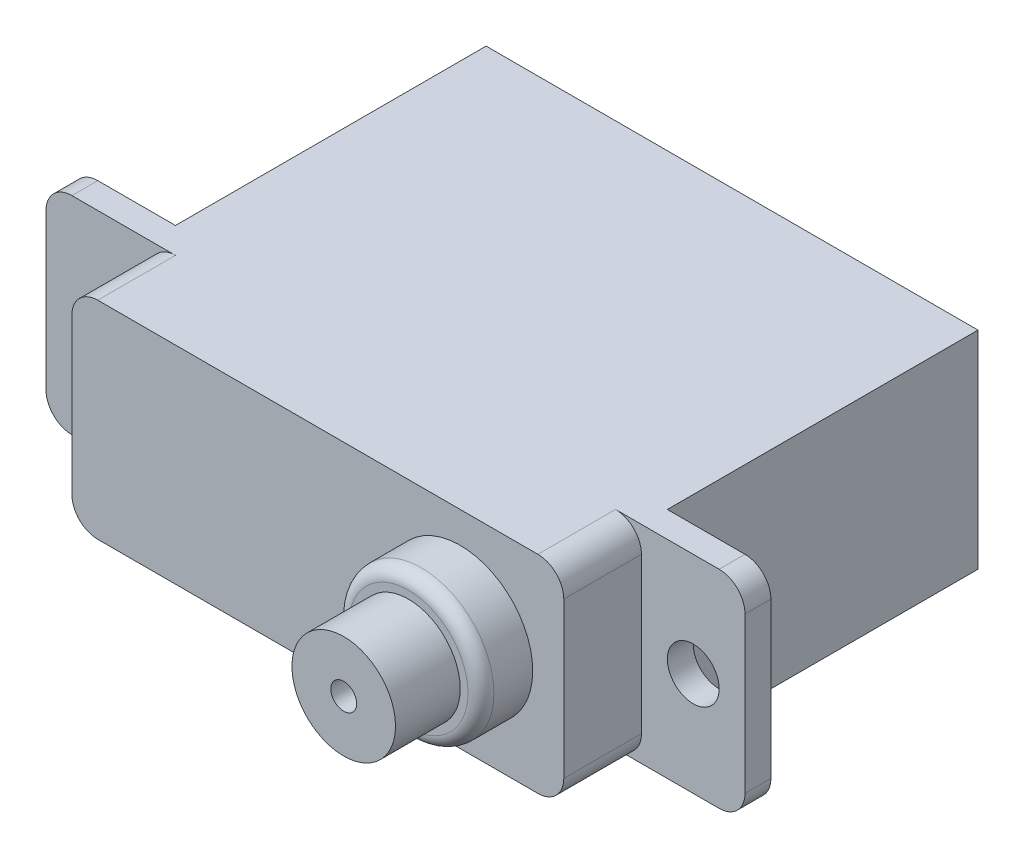
ISO-10303-21;
HEADER;
FILE_DESCRIPTION(('STEP AP214'),'2;1');
FILE_NAME('part.step','',(''),(''),'','','');
FILE_SCHEMA(('AUTOMOTIVE_DESIGN { 1 0 10303 214 1 1 1 1 }'));
ENDSEC;
DATA;
#1=APPLICATION_CONTEXT('core data for automotive mechanical design processes');
#2=APPLICATION_PROTOCOL_DEFINITION('international standard','automotive_design',2000,#1);
#3=PRODUCT_CONTEXT('',#1,'mechanical');
#4=PRODUCT('Part','Part','',(#3));
#5=PRODUCT_RELATED_PRODUCT_CATEGORY('part','',(#4));
#6=PRODUCT_DEFINITION_FORMATION('','',#4);
#7=PRODUCT_DEFINITION_CONTEXT('part definition',#1,'design');
#8=PRODUCT_DEFINITION('design','',#6,#7);
#9=PRODUCT_DEFINITION_SHAPE('','',#8);
#10=(LENGTH_UNIT() NAMED_UNIT(*) SI_UNIT(.MILLI.,.METRE.));
#11=(NAMED_UNIT(*) PLANE_ANGLE_UNIT() SI_UNIT($,.RADIAN.));
#12=(NAMED_UNIT(*) SI_UNIT($,.STERADIAN.) SOLID_ANGLE_UNIT());
#13=UNCERTAINTY_MEASURE_WITH_UNIT(LENGTH_MEASURE(1.E-05),#10,'distance_accuracy_value','');
#14=(GEOMETRIC_REPRESENTATION_CONTEXT(3) GLOBAL_UNCERTAINTY_ASSIGNED_CONTEXT((#13)) GLOBAL_UNIT_ASSIGNED_CONTEXT((#10,
#11,#12)) REPRESENTATION_CONTEXT('',''));
#15=CARTESIAN_POINT('',(0.,0.,0.));
#16=DIRECTION('',(0.,0.,1.));
#17=DIRECTION('',(1.,0.,0.));
#18=AXIS2_PLACEMENT_3D('',#15,#16,#17);
#19=CARTESIAN_POINT('',(5.5,0.,18.));
#20=DIRECTION('',(0.,0.,1.));
#21=DIRECTION('',(1.,0.,0.));
#22=AXIS2_PLACEMENT_3D('',#19,#20,#21);
#23=PLANE('',#22);
#24=CARTESIAN_POINT('',(5.5,0.,18.));
#25=DIRECTION('',(0.,0.,1.));
#26=DIRECTION('',(1.,0.,0.));
#27=AXIS2_PLACEMENT_3D('',#24,#25,#26);
#28=CIRCLE('',#27,2.3);
#29=CARTESIAN_POINT('',(7.8,0.,18.));
#30=VERTEX_POINT('',#29);
#31=EDGE_CURVE('E39',#30,#30,#28,.T.);
#32=ORIENTED_EDGE('',*,*,#31,.T.);
#33=EDGE_LOOP('',(#32));
#34=FACE_BOUND('',#33,.T.);
#35=CARTESIAN_POINT('',(5.5,0.,18.));
#36=DIRECTION('',(0.,0.,1.));
#37=DIRECTION('',(1.,0.,0.));
#38=AXIS2_PLACEMENT_3D('',#35,#36,#37);
#39=CIRCLE('',#38,2.);
#40=CARTESIAN_POINT('',(7.5,0.,18.));
#41=VERTEX_POINT('',#40);
#42=EDGE_CURVE('E518',#41,#41,#39,.T.);
#43=ORIENTED_EDGE('',*,*,#42,.F.);
#44=EDGE_LOOP('',(#43));
#45=FACE_BOUND('',#44,.T.);
#46=ADVANCED_FACE('F31',(#34,#45),#23,.T.);
#47=CARTESIAN_POINT('',(8.5,-3.,16.));
#48=DIRECTION('',(0.,0.,1.));
#49=DIRECTION('',(1.,0.,0.));
#50=AXIS2_PLACEMENT_3D('',#47,#48,#49);
#51=PLANE('',#50);
#52=CARTESIAN_POINT('',(8.5,-3.,16.));
#53=DIRECTION('',(0.,0.,1.));
#54=DIRECTION('',(1.,0.,0.));
#55=AXIS2_PLACEMENT_3D('',#52,#53,#54);
#56=CIRCLE('',#55,1.);
#57=CARTESIAN_POINT('',(8.49999999999999,-4.,16.));
#58=VERTEX_POINT('',#57);
#59=CARTESIAN_POINT('',(9.5,-2.99999999999999,16.));
#60=VERTEX_POINT('',#59);
#61=EDGE_CURVE('E178',#58,#60,#56,.T.);
#62=ORIENTED_EDGE('',*,*,#61,.T.);
#63=DIRECTION('',(0.,1.,0.));
#64=VECTOR('',#63,1.);
#65=CARTESIAN_POINT('',(9.5,-2.99999999999999,16.));
#66=LINE('',#65,#64);
#67=CARTESIAN_POINT('',(9.5,2.99999999999999,16.));
#68=VERTEX_POINT('',#67);
#69=EDGE_CURVE('E166',#60,#68,#66,.T.);
#70=ORIENTED_EDGE('',*,*,#69,.T.);
#71=CARTESIAN_POINT('',(8.5,3.,16.));
#72=DIRECTION('',(0.,0.,1.));
#73=DIRECTION('',(-1.,0.,0.));
#74=AXIS2_PLACEMENT_3D('',#71,#72,#73);
#75=CIRCLE('',#74,1.);
#76=CARTESIAN_POINT('',(8.49999999999999,4.,16.));
#77=VERTEX_POINT('',#76);
#78=EDGE_CURVE('E177',#68,#77,#75,.T.);
#79=ORIENTED_EDGE('',*,*,#78,.T.);
#80=DIRECTION('',(-1.,0.,0.));
#81=VECTOR('',#80,1.);
#82=CARTESIAN_POINT('',(-8.49999999999999,4.,16.));
#83=LINE('',#82,#81);
#84=CARTESIAN_POINT('',(-8.49999999999999,4.,16.));
#85=VERTEX_POINT('',#84);
#86=EDGE_CURVE('E511',#77,#85,#83,.T.);
#87=ORIENTED_EDGE('',*,*,#86,.T.);
#88=CARTESIAN_POINT('',(-8.5,3.,16.));
#89=DIRECTION('',(0.,0.,1.));
#90=DIRECTION('',(-1.,0.,0.));
#91=AXIS2_PLACEMENT_3D('',#88,#89,#90);
#92=CIRCLE('',#91,1.);
#93=CARTESIAN_POINT('',(-9.5,2.99999999999999,16.));
#94=VERTEX_POINT('',#93);
#95=EDGE_CURVE('E509',#85,#94,#92,.T.);
#96=ORIENTED_EDGE('',*,*,#95,.T.);
#97=DIRECTION('',(0.,-1.,0.));
#98=VECTOR('',#97,1.);
#99=CARTESIAN_POINT('',(-9.5,-2.99999999999999,16.));
#100=LINE('',#99,#98);
#101=CARTESIAN_POINT('',(-9.5,-2.99999999999999,16.));
#102=VERTEX_POINT('',#101);
#103=EDGE_CURVE('E507',#94,#102,#100,.T.);
#104=ORIENTED_EDGE('',*,*,#103,.T.);
#105=CARTESIAN_POINT('',(-8.5,-3.,16.));
#106=DIRECTION('',(0.,0.,1.));
#107=DIRECTION('',(-1.,0.,0.));
#108=AXIS2_PLACEMENT_3D('',#105,#106,#107);
#109=CIRCLE('',#108,1.);
#110=CARTESIAN_POINT('',(-8.49999999999999,-4.,16.));
#111=VERTEX_POINT('',#110);
#112=EDGE_CURVE('E467',#102,#111,#109,.T.);
#113=ORIENTED_EDGE('',*,*,#112,.T.);
#114=DIRECTION('',(1.,0.,0.));
#115=VECTOR('',#114,1.);
#116=CARTESIAN_POINT('',(-8.49999999999999,-4.,16.));
#117=LINE('',#116,#115);
#118=EDGE_CURVE('E184',#111,#58,#117,.T.);
#119=ORIENTED_EDGE('',*,*,#118,.T.);
#120=EDGE_LOOP('',(#62,#70,#79,#87,#96,#104,#113,#119));
#121=FACE_BOUND('',#120,.T.);
#122=CARTESIAN_POINT('',(5.5,0.,16.));
#123=DIRECTION('',(0.,0.,1.));
#124=DIRECTION('',(1.,0.,0.));
#125=AXIS2_PLACEMENT_3D('',#122,#123,#124);
#126=CIRCLE('',#125,2.8);
#127=CARTESIAN_POINT('',(8.3,0.,16.));
#128=VERTEX_POINT('',#127);
#129=EDGE_CURVE('E514',#128,#128,#126,.T.);
#130=ORIENTED_EDGE('',*,*,#129,.F.);
#131=EDGE_LOOP('',(#130));
#132=FACE_BOUND('',#131,.T.);
#133=ADVANCED_FACE('F181',(#121,#132),#51,.T.);
#134=CARTESIAN_POINT('',(12.5,3.,13.));
#135=DIRECTION('',(0.,0.,-1.));
#136=DIRECTION('',(-1.,0.,0.));
#137=AXIS2_PLACEMENT_3D('',#134,#135,#136);
#138=PLANE('',#137);
#139=CARTESIAN_POINT('',(-11.5,0.,13.));
#140=DIRECTION('',(0.,0.,1.));
#141=DIRECTION('',(1.,0.,0.));
#142=AXIS2_PLACEMENT_3D('',#139,#140,#141);
#143=CIRCLE('',#142,1.);
#144=CARTESIAN_POINT('',(-10.5,0.,13.));
#145=VERTEX_POINT('',#144);
#146=EDGE_CURVE('E203',#145,#145,#143,.T.);
#147=ORIENTED_EDGE('',*,*,#146,.F.);
#148=EDGE_LOOP('',(#147));
#149=FACE_BOUND('',#148,.T.);
#150=CARTESIAN_POINT('',(-8.5,-3.,13.));
#151=DIRECTION('',(0.,0.,1.));
#152=DIRECTION('',(-1.,0.,0.));
#153=AXIS2_PLACEMENT_3D('',#150,#151,#152);
#154=CIRCLE('',#153,1.);
#155=CARTESIAN_POINT('',(-9.5,-2.99999999999999,13.));
#156=VERTEX_POINT('',#155);
#157=CARTESIAN_POINT('',(-8.5,-4.,13.));
#158=VERTEX_POINT('',#157);
#159=EDGE_CURVE('E46',#156,#158,#154,.T.);
#160=ORIENTED_EDGE('',*,*,#159,.F.);
#161=DIRECTION('',(0.,-1.,0.));
#162=VECTOR('',#161,1.);
#163=CARTESIAN_POINT('',(-9.5,-2.99999999999999,13.));
#164=LINE('',#163,#162);
#165=CARTESIAN_POINT('',(-9.5,2.99999999999999,13.));
#166=VERTEX_POINT('',#165);
#167=EDGE_CURVE('E50',#166,#156,#164,.T.);
#168=ORIENTED_EDGE('',*,*,#167,.F.);
#169=CARTESIAN_POINT('',(-8.5,3.,13.));
#170=DIRECTION('',(0.,0.,1.));
#171=DIRECTION('',(-1.,0.,0.));
#172=AXIS2_PLACEMENT_3D('',#169,#170,#171);
#173=CIRCLE('',#172,1.);
#174=CARTESIAN_POINT('',(-8.5,4.,13.));
#175=VERTEX_POINT('',#174);
#176=EDGE_CURVE('E500',#175,#166,#173,.T.);
#177=ORIENTED_EDGE('',*,*,#176,.F.);
#178=DIRECTION('',(-1.,0.,0.));
#179=VECTOR('',#178,1.);
#180=CARTESIAN_POINT('',(-12.5,4.,13.));
#181=LINE('',#180,#179);
#182=CARTESIAN_POINT('',(-12.5,4.,13.));
#183=VERTEX_POINT('',#182);
#184=EDGE_CURVE('E212',#175,#183,#181,.T.);
#185=ORIENTED_EDGE('',*,*,#184,.T.);
#186=CARTESIAN_POINT('',(-12.5,3.,13.));
#187=DIRECTION('',(0.,0.,1.));
#188=DIRECTION('',(-1.,0.,0.));
#189=AXIS2_PLACEMENT_3D('',#186,#187,#188);
#190=CIRCLE('',#189,1.);
#191=CARTESIAN_POINT('',(-13.5,2.99999999999999,13.));
#192=VERTEX_POINT('',#191);
#193=EDGE_CURVE('E216',#183,#192,#190,.T.);
#194=ORIENTED_EDGE('',*,*,#193,.T.);
#195=DIRECTION('',(0.,-1.,0.));
#196=VECTOR('',#195,1.);
#197=CARTESIAN_POINT('',(-13.5,-2.99999999999999,13.));
#198=LINE('',#197,#196);
#199=CARTESIAN_POINT('',(-13.5,-2.99999999999999,13.));
#200=VERTEX_POINT('',#199);
#201=EDGE_CURVE('E323',#192,#200,#198,.T.);
#202=ORIENTED_EDGE('',*,*,#201,.T.);
#203=CARTESIAN_POINT('',(-12.5,-3.,13.));
#204=DIRECTION('',(0.,0.,1.));
#205=DIRECTION('',(-1.,0.,0.));
#206=AXIS2_PLACEMENT_3D('',#203,#204,#205);
#207=CIRCLE('',#206,1.);
#208=CARTESIAN_POINT('',(-12.5,-4.,13.));
#209=VERTEX_POINT('',#208);
#210=EDGE_CURVE('E446',#200,#209,#207,.T.);
#211=ORIENTED_EDGE('',*,*,#210,.T.);
#212=DIRECTION('',(1.,0.,0.));
#213=VECTOR('',#212,1.);
#214=CARTESIAN_POINT('',(-12.5,-4.,13.));
#215=LINE('',#214,#213);
#216=EDGE_CURVE('E444',#209,#158,#215,.T.);
#217=ORIENTED_EDGE('',*,*,#216,.T.);
#218=EDGE_LOOP('',(#160,#168,#177,#185,#194,#202,#211,#217));
#219=FACE_BOUND('',#218,.T.);
#220=ADVANCED_FACE('F369',(#149,#219),#138,.F.);
#221=CARTESIAN_POINT('',(11.5,0.,13.));
#222=DIRECTION('',(0.,0.,1.));
#223=DIRECTION('',(1.,0.,0.));
#224=AXIS2_PLACEMENT_3D('',#221,#222,#223);
#225=CIRCLE('',#224,1.);
#226=CARTESIAN_POINT('',(12.5,0.,13.));
#227=VERTEX_POINT('',#226);
#228=EDGE_CURVE('E194',#227,#227,#225,.T.);
#229=ORIENTED_EDGE('',*,*,#228,.F.);
#230=EDGE_LOOP('',(#229));
#231=FACE_BOUND('',#230,.T.);
#232=CARTESIAN_POINT('',(8.5,-3.,13.));
#233=DIRECTION('',(0.,0.,1.));
#234=DIRECTION('',(1.,0.,0.));
#235=AXIS2_PLACEMENT_3D('',#232,#233,#234);
#236=CIRCLE('',#235,1.);
#237=CARTESIAN_POINT('',(8.5,-4.,13.));
#238=VERTEX_POINT('',#237);
#239=CARTESIAN_POINT('',(9.5,-2.99999999999999,13.));
#240=VERTEX_POINT('',#239);
#241=EDGE_CURVE('E190',#238,#240,#236,.T.);
#242=ORIENTED_EDGE('',*,*,#241,.F.);
#243=CARTESIAN_POINT('',(12.5,-4.,13.));
#244=VERTEX_POINT('',#243);
#245=EDGE_CURVE('E447',#238,#244,#215,.T.);
#246=ORIENTED_EDGE('',*,*,#245,.T.);
#247=CARTESIAN_POINT('',(12.5,-3.,13.));
#248=DIRECTION('',(0.,0.,1.));
#249=DIRECTION('',(1.,0.,0.));
#250=AXIS2_PLACEMENT_3D('',#247,#248,#249);
#251=CIRCLE('',#250,1.);
#252=CARTESIAN_POINT('',(13.5,-2.99999999999999,13.));
#253=VERTEX_POINT('',#252);
#254=EDGE_CURVE('E453',#244,#253,#251,.T.);
#255=ORIENTED_EDGE('',*,*,#254,.T.);
#256=DIRECTION('',(0.,1.,0.));
#257=VECTOR('',#256,1.);
#258=CARTESIAN_POINT('',(13.5,-2.99999999999999,13.));
#259=LINE('',#258,#257);
#260=CARTESIAN_POINT('',(13.5,2.99999999999999,13.));
#261=VERTEX_POINT('',#260);
#262=EDGE_CURVE('E304',#253,#261,#259,.T.);
#263=ORIENTED_EDGE('',*,*,#262,.T.);
#264=CARTESIAN_POINT('',(12.5,3.,13.));
#265=DIRECTION('',(0.,0.,1.));
#266=DIRECTION('',(-1.,0.,0.));
#267=AXIS2_PLACEMENT_3D('',#264,#265,#266);
#268=CIRCLE('',#267,1.);
#269=CARTESIAN_POINT('',(12.5,4.,13.));
#270=VERTEX_POINT('',#269);
#271=EDGE_CURVE('E209',#261,#270,#268,.T.);
#272=ORIENTED_EDGE('',*,*,#271,.T.);
#273=CARTESIAN_POINT('',(8.5,4.,13.));
#274=VERTEX_POINT('',#273);
#275=EDGE_CURVE('E222',#270,#274,#181,.T.);
#276=ORIENTED_EDGE('',*,*,#275,.T.);
#277=CARTESIAN_POINT('',(8.5,3.,13.));
#278=DIRECTION('',(0.,0.,1.));
#279=DIRECTION('',(-1.,0.,0.));
#280=AXIS2_PLACEMENT_3D('',#277,#278,#279);
#281=CIRCLE('',#280,1.);
#282=CARTESIAN_POINT('',(9.5,2.99999999999999,13.));
#283=VERTEX_POINT('',#282);
#284=EDGE_CURVE('E498',#283,#274,#281,.T.);
#285=ORIENTED_EDGE('',*,*,#284,.F.);
#286=DIRECTION('',(0.,1.,0.));
#287=VECTOR('',#286,1.);
#288=CARTESIAN_POINT('',(9.5,-2.99999999999999,13.));
#289=LINE('',#288,#287);
#290=EDGE_CURVE('E501',#240,#283,#289,.T.);
#291=ORIENTED_EDGE('',*,*,#290,.F.);
#292=EDGE_LOOP('',(#242,#246,#255,#263,#272,#276,#285,#291));
#293=FACE_BOUND('',#292,.T.);
#294=ADVANCED_FACE('F362',(#231,#293),#138,.F.);
#295=CARTESIAN_POINT('',(9.5,-4.,12.));
#296=DIRECTION('',(-1.,0.,0.));
#297=DIRECTION('',(0.,0.,1.));
#298=AXIS2_PLACEMENT_3D('',#295,#296,#297);
#299=PLANE('',#298);
#300=DIRECTION('',(0.,1.,0.));
#301=VECTOR('',#300,1.);
#302=CARTESIAN_POINT('',(9.5,-4.,0.));
#303=LINE('',#302,#301);
#304=CARTESIAN_POINT('',(9.5,-4.,0.));
#305=VERTEX_POINT('',#304);
#306=CARTESIAN_POINT('',(9.5,4.,0.));
#307=VERTEX_POINT('',#306);
#308=EDGE_CURVE('E252',#305,#307,#303,.T.);
#309=ORIENTED_EDGE('',*,*,#308,.T.);
#310=DIRECTION('',(0.,0.,-1.));
#311=VECTOR('',#310,1.);
#312=CARTESIAN_POINT('',(9.5,4.,12.));
#313=LINE('',#312,#311);
#314=CARTESIAN_POINT('',(9.5,4.,12.));
#315=VERTEX_POINT('',#314);
#316=EDGE_CURVE('E233',#315,#307,#313,.T.);
#317=ORIENTED_EDGE('',*,*,#316,.F.);
#318=DIRECTION('',(0.,1.,0.));
#319=VECTOR('',#318,1.);
#320=CARTESIAN_POINT('',(9.5,-4.,12.));
#321=LINE('',#320,#319);
#322=CARTESIAN_POINT('',(9.5,-4.,12.));
#323=VERTEX_POINT('',#322);
#324=EDGE_CURVE('E237',#323,#315,#321,.T.);
#325=ORIENTED_EDGE('',*,*,#324,.F.);
#326=DIRECTION('',(0.,0.,-1.));
#327=VECTOR('',#326,1.);
#328=CARTESIAN_POINT('',(9.5,-4.,12.));
#329=LINE('',#328,#327);
#330=EDGE_CURVE('E226',#323,#305,#329,.T.);
#331=ORIENTED_EDGE('',*,*,#330,.T.);
#332=EDGE_LOOP('',(#309,#317,#325,#331));
#333=FACE_BOUND('',#332,.T.);
#334=ADVANCED_FACE('F351',(#333),#299,.F.);
#335=CARTESIAN_POINT('',(-9.5,4.,12.));
#336=DIRECTION('',(0.,-1.,0.));
#337=DIRECTION('',(0.,0.,-1.));
#338=AXIS2_PLACEMENT_3D('',#335,#336,#337);
#339=PLANE('',#338);
#340=DIRECTION('',(-1.,0.,0.));
#341=VECTOR('',#340,1.);
#342=CARTESIAN_POINT('',(-9.5,4.,0.));
#343=LINE('',#342,#341);
#344=CARTESIAN_POINT('',(-9.5,4.,0.));
#345=VERTEX_POINT('',#344);
#346=EDGE_CURVE('E270',#307,#345,#343,.T.);
#347=ORIENTED_EDGE('',*,*,#346,.T.);
#348=DIRECTION('',(0.,0.,-1.));
#349=VECTOR('',#348,1.);
#350=CARTESIAN_POINT('',(-9.5,4.,12.));
#351=LINE('',#350,#349);
#352=CARTESIAN_POINT('',(-9.5,4.,12.));
#353=VERTEX_POINT('',#352);
#354=EDGE_CURVE('E236',#353,#345,#351,.T.);
#355=ORIENTED_EDGE('',*,*,#354,.F.);
#356=DIRECTION('',(-1.,0.,0.));
#357=VECTOR('',#356,1.);
#358=CARTESIAN_POINT('',(-12.5,4.,12.));
#359=LINE('',#358,#357);
#360=CARTESIAN_POINT('',(-12.5,4.,12.));
#361=VERTEX_POINT('',#360);
#362=EDGE_CURVE('E247',#353,#361,#359,.T.);
#363=ORIENTED_EDGE('',*,*,#362,.T.);
#364=DIRECTION('',(0.,0.,-1.));
#365=VECTOR('',#364,1.);
#366=CARTESIAN_POINT('',(-12.5,4.,13.));
#367=LINE('',#366,#365);
#368=EDGE_CURVE('E277',#183,#361,#367,.T.);
#369=ORIENTED_EDGE('',*,*,#368,.F.);
#370=ORIENTED_EDGE('',*,*,#184,.F.);
#371=DIRECTION('',(0.,0.,-1.));
#372=VECTOR('',#371,1.);
#373=CARTESIAN_POINT('',(-8.49999999999999,4.,16.));
#374=LINE('',#373,#372);
#375=EDGE_CURVE('E483',#85,#175,#374,.T.);
#376=ORIENTED_EDGE('',*,*,#375,.F.);
#377=ORIENTED_EDGE('',*,*,#86,.F.);
#378=DIRECTION('',(0.,0.,-1.));
#379=VECTOR('',#378,1.);
#380=CARTESIAN_POINT('',(8.49999999999999,4.,16.));
#381=LINE('',#380,#379);
#382=EDGE_CURVE('E196',#77,#274,#381,.T.);
#383=ORIENTED_EDGE('',*,*,#382,.T.);
#384=ORIENTED_EDGE('',*,*,#275,.F.);
#385=DIRECTION('',(0.,0.,-1.));
#386=VECTOR('',#385,1.);
#387=CARTESIAN_POINT('',(12.5,4.,13.));
#388=LINE('',#387,#386);
#389=CARTESIAN_POINT('',(12.5,4.,12.));
#390=VERTEX_POINT('',#389);
#391=EDGE_CURVE('E273',#270,#390,#388,.T.);
#392=ORIENTED_EDGE('',*,*,#391,.T.);
#393=EDGE_CURVE('E333',#390,#315,#359,.T.);
#394=ORIENTED_EDGE('',*,*,#393,.T.);
#395=ORIENTED_EDGE('',*,*,#316,.T.);
#396=EDGE_LOOP('',(#347,#355,#363,#369,#370,#376,#377,#383,#384,#392,#394,#395));
#397=FACE_BOUND('',#396,.T.);
#398=ADVANCED_FACE('F352',(#397),#339,.F.);
#399=CARTESIAN_POINT('',(-9.5,-4.,12.));
#400=DIRECTION('',(1.,0.,0.));
#401=DIRECTION('',(0.,0.,-1.));
#402=AXIS2_PLACEMENT_3D('',#399,#400,#401);
#403=PLANE('',#402);
#404=DIRECTION('',(0.,-1.,0.));
#405=VECTOR('',#404,1.);
#406=CARTESIAN_POINT('',(-9.5,-4.,0.));
#407=LINE('',#406,#405);
#408=CARTESIAN_POINT('',(-9.5,-4.,0.));
#409=VERTEX_POINT('',#408);
#410=EDGE_CURVE('E269',#345,#409,#407,.T.);
#411=ORIENTED_EDGE('',*,*,#410,.T.);
#412=DIRECTION('',(0.,0.,-1.));
#413=VECTOR('',#412,1.);
#414=CARTESIAN_POINT('',(-9.5,-4.,12.));
#415=LINE('',#414,#413);
#416=CARTESIAN_POINT('',(-9.5,-4.,12.));
#417=VERTEX_POINT('',#416);
#418=EDGE_CURVE('E229',#417,#409,#415,.T.);
#419=ORIENTED_EDGE('',*,*,#418,.F.);
#420=DIRECTION('',(0.,-1.,0.));
#421=VECTOR('',#420,1.);
#422=CARTESIAN_POINT('',(-9.5,-4.,12.));
#423=LINE('',#422,#421);
#424=EDGE_CURVE('E230',#353,#417,#423,.T.);
#425=ORIENTED_EDGE('',*,*,#424,.F.);
#426=ORIENTED_EDGE('',*,*,#354,.T.);
#427=EDGE_LOOP('',(#411,#419,#425,#426));
#428=FACE_BOUND('',#427,.T.);
#429=ADVANCED_FACE('F354',(#428),#403,.F.);
#430=CARTESIAN_POINT('',(-9.5,-4.,12.));
#431=DIRECTION('',(0.,1.,0.));
#432=DIRECTION('',(0.,0.,1.));
#433=AXIS2_PLACEMENT_3D('',#430,#431,#432);
#434=PLANE('',#433);
#435=DIRECTION('',(1.,0.,0.));
#436=VECTOR('',#435,1.);
#437=CARTESIAN_POINT('',(-9.5,-4.,0.));
#438=LINE('',#437,#436);
#439=EDGE_CURVE('E241',#409,#305,#438,.T.);
#440=ORIENTED_EDGE('',*,*,#439,.T.);
#441=ORIENTED_EDGE('',*,*,#330,.F.);
#442=DIRECTION('',(1.,0.,0.));
#443=VECTOR('',#442,1.);
#444=CARTESIAN_POINT('',(-12.5,-4.,12.));
#445=LINE('',#444,#443);
#446=CARTESIAN_POINT('',(12.5,-4.,12.));
#447=VERTEX_POINT('',#446);
#448=EDGE_CURVE('E291',#323,#447,#445,.T.);
#449=ORIENTED_EDGE('',*,*,#448,.T.);
#450=DIRECTION('',(0.,0.,-1.));
#451=VECTOR('',#450,1.);
#452=CARTESIAN_POINT('',(12.5,-4.,13.));
#453=LINE('',#452,#451);
#454=EDGE_CURVE('E307',#244,#447,#453,.T.);
#455=ORIENTED_EDGE('',*,*,#454,.F.);
#456=ORIENTED_EDGE('',*,*,#245,.F.);
#457=DIRECTION('',(0.,0.,-1.));
#458=VECTOR('',#457,1.);
#459=CARTESIAN_POINT('',(8.49999999999999,-4.,16.));
#460=LINE('',#459,#458);
#461=EDGE_CURVE('E462',#58,#238,#460,.T.);
#462=ORIENTED_EDGE('',*,*,#461,.F.);
#463=ORIENTED_EDGE('',*,*,#118,.F.);
#464=DIRECTION('',(0.,0.,-1.));
#465=VECTOR('',#464,1.);
#466=CARTESIAN_POINT('',(-8.49999999999999,-4.,16.));
#467=LINE('',#466,#465);
#468=EDGE_CURVE('E463',#111,#158,#467,.T.);
#469=ORIENTED_EDGE('',*,*,#468,.T.);
#470=ORIENTED_EDGE('',*,*,#216,.F.);
#471=DIRECTION('',(0.,0.,-1.));
#472=VECTOR('',#471,1.);
#473=CARTESIAN_POINT('',(-12.5,-4.,13.));
#474=LINE('',#473,#472);
#475=CARTESIAN_POINT('',(-12.5,-4.,12.));
#476=VERTEX_POINT('',#475);
#477=EDGE_CURVE('E310',#209,#476,#474,.T.);
#478=ORIENTED_EDGE('',*,*,#477,.T.);
#479=EDGE_CURVE('E287',#476,#417,#445,.T.);
#480=ORIENTED_EDGE('',*,*,#479,.T.);
#481=ORIENTED_EDGE('',*,*,#418,.T.);
#482=EDGE_LOOP('',(#440,#441,#449,#455,#456,#462,#463,#469,#470,#478,#480,#481));
#483=FACE_BOUND('',#482,.T.);
#484=ADVANCED_FACE('F360',(#483),#434,.F.);
#485=CARTESIAN_POINT('',(9.5,4.,0.));
#486=DIRECTION('',(0.,0.,-1.));
#487=DIRECTION('',(-1.,0.,0.));
#488=AXIS2_PLACEMENT_3D('',#485,#486,#487);
#489=PLANE('',#488);
#490=ORIENTED_EDGE('',*,*,#308,.F.);
#491=ORIENTED_EDGE('',*,*,#439,.F.);
#492=ORIENTED_EDGE('',*,*,#410,.F.);
#493=ORIENTED_EDGE('',*,*,#346,.F.);
#494=EDGE_LOOP('',(#490,#491,#492,#493));
#495=FACE_BOUND('',#494,.T.);
#496=ADVANCED_FACE('F434',(#495),#489,.T.);
#497=CARTESIAN_POINT('',(12.5,3.,12.));
#498=DIRECTION('',(0.,0.,-1.));
#499=DIRECTION('',(-1.,0.,0.));
#500=AXIS2_PLACEMENT_3D('',#497,#498,#499);
#501=PLANE('',#500);
#502=CARTESIAN_POINT('',(11.5,0.,12.));
#503=DIRECTION('',(0.,0.,1.));
#504=DIRECTION('',(1.,0.,0.));
#505=AXIS2_PLACEMENT_3D('',#502,#503,#504);
#506=CIRCLE('',#505,1.);
#507=CARTESIAN_POINT('',(12.5,0.,12.));
#508=VERTEX_POINT('',#507);
#509=EDGE_CURVE('E191',#508,#508,#506,.T.);
#510=ORIENTED_EDGE('',*,*,#509,.T.);
#511=EDGE_LOOP('',(#510));
#512=FACE_BOUND('',#511,.T.);
#513=ORIENTED_EDGE('',*,*,#448,.F.);
#514=ORIENTED_EDGE('',*,*,#324,.T.);
#515=ORIENTED_EDGE('',*,*,#393,.F.);
#516=CARTESIAN_POINT('',(12.5,3.,12.));
#517=DIRECTION('',(0.,0.,1.));
#518=DIRECTION('',(-1.,0.,0.));
#519=AXIS2_PLACEMENT_3D('',#516,#517,#518);
#520=CIRCLE('',#519,1.);
#521=CARTESIAN_POINT('',(13.5,2.99999999999999,12.));
#522=VERTEX_POINT('',#521);
#523=EDGE_CURVE('E206',#522,#390,#520,.T.);
#524=ORIENTED_EDGE('',*,*,#523,.F.);
#525=DIRECTION('',(0.,1.,0.));
#526=VECTOR('',#525,1.);
#527=CARTESIAN_POINT('',(13.5,-2.99999999999999,12.));
#528=LINE('',#527,#526);
#529=CARTESIAN_POINT('',(13.5,-2.99999999999999,12.));
#530=VERTEX_POINT('',#529);
#531=EDGE_CURVE('E213',#530,#522,#528,.T.);
#532=ORIENTED_EDGE('',*,*,#531,.F.);
#533=CARTESIAN_POINT('',(12.5,-3.,12.));
#534=DIRECTION('',(0.,0.,1.));
#535=DIRECTION('',(1.,0.,0.));
#536=AXIS2_PLACEMENT_3D('',#533,#534,#535);
#537=CIRCLE('',#536,1.);
#538=EDGE_CURVE('E290',#447,#530,#537,.T.);
#539=ORIENTED_EDGE('',*,*,#538,.F.);
#540=EDGE_LOOP('',(#513,#514,#515,#524,#532,#539));
#541=FACE_BOUND('',#540,.T.);
#542=ADVANCED_FACE('F348',(#512,#541),#501,.T.);
#543=CARTESIAN_POINT('',(-11.5,0.,12.));
#544=DIRECTION('',(0.,0.,1.));
#545=DIRECTION('',(1.,0.,0.));
#546=AXIS2_PLACEMENT_3D('',#543,#544,#545);
#547=CIRCLE('',#546,1.);
#548=CARTESIAN_POINT('',(-10.5,0.,12.));
#549=VERTEX_POINT('',#548);
#550=EDGE_CURVE('E201',#549,#549,#547,.T.);
#551=ORIENTED_EDGE('',*,*,#550,.T.);
#552=EDGE_LOOP('',(#551));
#553=FACE_BOUND('',#552,.T.);
#554=ORIENTED_EDGE('',*,*,#362,.F.);
#555=ORIENTED_EDGE('',*,*,#424,.T.);
#556=ORIENTED_EDGE('',*,*,#479,.F.);
#557=CARTESIAN_POINT('',(-12.5,-3.,12.));
#558=DIRECTION('',(0.,0.,1.));
#559=DIRECTION('',(-1.,0.,0.));
#560=AXIS2_PLACEMENT_3D('',#557,#558,#559);
#561=CIRCLE('',#560,1.);
#562=CARTESIAN_POINT('',(-13.5,-2.99999999999999,12.));
#563=VERTEX_POINT('',#562);
#564=EDGE_CURVE('E295',#563,#476,#561,.T.);
#565=ORIENTED_EDGE('',*,*,#564,.F.);
#566=DIRECTION('',(0.,-1.,0.));
#567=VECTOR('',#566,1.);
#568=CARTESIAN_POINT('',(-13.5,-2.99999999999999,12.));
#569=LINE('',#568,#567);
#570=CARTESIAN_POINT('',(-13.5,2.99999999999999,12.));
#571=VERTEX_POINT('',#570);
#572=EDGE_CURVE('E322',#571,#563,#569,.T.);
#573=ORIENTED_EDGE('',*,*,#572,.F.);
#574=CARTESIAN_POINT('',(-12.5,3.,12.));
#575=DIRECTION('',(0.,0.,1.));
#576=DIRECTION('',(-1.,0.,0.));
#577=AXIS2_PLACEMENT_3D('',#574,#575,#576);
#578=CIRCLE('',#577,1.);
#579=EDGE_CURVE('E331',#361,#571,#578,.T.);
#580=ORIENTED_EDGE('',*,*,#579,.F.);
#581=EDGE_LOOP('',(#554,#555,#556,#565,#573,#580));
#582=FACE_BOUND('',#581,.T.);
#583=ADVANCED_FACE('F330',(#553,#582),#501,.T.);
#584=CARTESIAN_POINT('',(12.5,3.,13.));
#585=DIRECTION('',(0.,0.,-1.));
#586=DIRECTION('',(-1.,0.,0.));
#587=AXIS2_PLACEMENT_3D('',#584,#585,#586);
#588=CYLINDRICAL_SURFACE('',#587,1.);
#589=ORIENTED_EDGE('',*,*,#523,.T.);
#590=ORIENTED_EDGE('',*,*,#391,.F.);
#591=ORIENTED_EDGE('',*,*,#271,.F.);
#592=DIRECTION('',(0.,0.,-1.));
#593=VECTOR('',#592,1.);
#594=CARTESIAN_POINT('',(13.5,2.99999999999999,13.));
#595=LINE('',#594,#593);
#596=EDGE_CURVE('E300',#261,#522,#595,.T.);
#597=ORIENTED_EDGE('',*,*,#596,.T.);
#598=EDGE_LOOP('',(#589,#590,#591,#597));
#599=FACE_BOUND('',#598,.T.);
#600=ADVANCED_FACE('F342',(#599),#588,.T.);
#601=CARTESIAN_POINT('',(-12.5,3.,13.));
#602=DIRECTION('',(0.,0.,-1.));
#603=DIRECTION('',(-1.,0.,0.));
#604=AXIS2_PLACEMENT_3D('',#601,#602,#603);
#605=CYLINDRICAL_SURFACE('',#604,1.);
#606=ORIENTED_EDGE('',*,*,#579,.T.);
#607=DIRECTION('',(0.,0.,-1.));
#608=VECTOR('',#607,1.);
#609=CARTESIAN_POINT('',(-13.5,2.99999999999999,13.));
#610=LINE('',#609,#608);
#611=EDGE_CURVE('E283',#192,#571,#610,.T.);
#612=ORIENTED_EDGE('',*,*,#611,.F.);
#613=ORIENTED_EDGE('',*,*,#193,.F.);
#614=ORIENTED_EDGE('',*,*,#368,.T.);
#615=EDGE_LOOP('',(#606,#612,#613,#614));
#616=FACE_BOUND('',#615,.T.);
#617=ADVANCED_FACE('F429',(#616),#605,.T.);
#618=CARTESIAN_POINT('',(-13.5,-2.99999999999999,13.));
#619=DIRECTION('',(1.,0.,0.));
#620=DIRECTION('',(0.,0.,-1.));
#621=AXIS2_PLACEMENT_3D('',#618,#619,#620);
#622=PLANE('',#621);
#623=ORIENTED_EDGE('',*,*,#572,.T.);
#624=DIRECTION('',(0.,0.,-1.));
#625=VECTOR('',#624,1.);
#626=CARTESIAN_POINT('',(-13.5,-2.99999999999999,13.));
#627=LINE('',#626,#625);
#628=EDGE_CURVE('E313',#200,#563,#627,.T.);
#629=ORIENTED_EDGE('',*,*,#628,.F.);
#630=ORIENTED_EDGE('',*,*,#201,.F.);
#631=ORIENTED_EDGE('',*,*,#611,.T.);
#632=EDGE_LOOP('',(#623,#629,#630,#631));
#633=FACE_BOUND('',#632,.T.);
#634=ADVANCED_FACE('F320',(#633),#622,.F.);
#635=CARTESIAN_POINT('',(-12.5,-3.,13.));
#636=DIRECTION('',(0.,0.,-1.));
#637=DIRECTION('',(-1.,0.,0.));
#638=AXIS2_PLACEMENT_3D('',#635,#636,#637);
#639=CYLINDRICAL_SURFACE('',#638,1.);
#640=ORIENTED_EDGE('',*,*,#564,.T.);
#641=ORIENTED_EDGE('',*,*,#477,.F.);
#642=ORIENTED_EDGE('',*,*,#210,.F.);
#643=ORIENTED_EDGE('',*,*,#628,.T.);
#644=EDGE_LOOP('',(#640,#641,#642,#643));
#645=FACE_BOUND('',#644,.T.);
#646=ADVANCED_FACE('F422',(#645),#639,.T.);
#647=CARTESIAN_POINT('',(12.5,-3.,13.));
#648=DIRECTION('',(0.,0.,-1.));
#649=DIRECTION('',(-1.,0.,0.));
#650=AXIS2_PLACEMENT_3D('',#647,#648,#649);
#651=CYLINDRICAL_SURFACE('',#650,1.);
#652=ORIENTED_EDGE('',*,*,#538,.T.);
#653=DIRECTION('',(0.,0.,-1.));
#654=VECTOR('',#653,1.);
#655=CARTESIAN_POINT('',(13.5,-2.99999999999999,13.));
#656=LINE('',#655,#654);
#657=EDGE_CURVE('E303',#253,#530,#656,.T.);
#658=ORIENTED_EDGE('',*,*,#657,.F.);
#659=ORIENTED_EDGE('',*,*,#254,.F.);
#660=ORIENTED_EDGE('',*,*,#454,.T.);
#661=EDGE_LOOP('',(#652,#658,#659,#660));
#662=FACE_BOUND('',#661,.T.);
#663=ADVANCED_FACE('F418',(#662),#651,.T.);
#664=CARTESIAN_POINT('',(13.5,-2.99999999999999,13.));
#665=DIRECTION('',(-1.,0.,0.));
#666=DIRECTION('',(0.,0.,1.));
#667=AXIS2_PLACEMENT_3D('',#664,#665,#666);
#668=PLANE('',#667);
#669=ORIENTED_EDGE('',*,*,#531,.T.);
#670=ORIENTED_EDGE('',*,*,#596,.F.);
#671=ORIENTED_EDGE('',*,*,#262,.F.);
#672=ORIENTED_EDGE('',*,*,#657,.T.);
#673=EDGE_LOOP('',(#669,#670,#671,#672));
#674=FACE_BOUND('',#673,.T.);
#675=ADVANCED_FACE('F408',(#674),#668,.F.);
#676=CARTESIAN_POINT('',(-11.5,0.,13.));
#677=DIRECTION('',(0.,0.,-1.));
#678=DIRECTION('',(-1.,0.,0.));
#679=AXIS2_PLACEMENT_3D('',#676,#677,#678);
#680=CYLINDRICAL_SURFACE('',#679,1.);
#681=ORIENTED_EDGE('',*,*,#146,.T.);
#682=EDGE_LOOP('',(#681));
#683=FACE_BOUND('',#682,.T.);
#684=ORIENTED_EDGE('',*,*,#550,.F.);
#685=EDGE_LOOP('',(#684));
#686=FACE_BOUND('',#685,.T.);
#687=ADVANCED_FACE('F404',(#683,#686),#680,.F.);
#688=CARTESIAN_POINT('',(11.5,0.,13.));
#689=DIRECTION('',(0.,0.,-1.));
#690=DIRECTION('',(-1.,0.,0.));
#691=AXIS2_PLACEMENT_3D('',#688,#689,#690);
#692=CYLINDRICAL_SURFACE('',#691,1.);
#693=ORIENTED_EDGE('',*,*,#228,.T.);
#694=EDGE_LOOP('',(#693));
#695=FACE_BOUND('',#694,.T.);
#696=ORIENTED_EDGE('',*,*,#509,.F.);
#697=EDGE_LOOP('',(#696));
#698=FACE_BOUND('',#697,.T.);
#699=ADVANCED_FACE('F401',(#695,#698),#692,.F.);
#700=CARTESIAN_POINT('',(8.5,-3.,16.));
#701=DIRECTION('',(0.,0.,-1.));
#702=DIRECTION('',(-1.,0.,0.));
#703=AXIS2_PLACEMENT_3D('',#700,#701,#702);
#704=CYLINDRICAL_SURFACE('',#703,1.);
#705=ORIENTED_EDGE('',*,*,#241,.T.);
#706=DIRECTION('',(0.,0.,-1.));
#707=VECTOR('',#706,1.);
#708=CARTESIAN_POINT('',(9.5,-2.99999999999999,16.));
#709=LINE('',#708,#707);
#710=EDGE_CURVE('E171',#60,#240,#709,.T.);
#711=ORIENTED_EDGE('',*,*,#710,.F.);
#712=ORIENTED_EDGE('',*,*,#61,.F.);
#713=ORIENTED_EDGE('',*,*,#461,.T.);
#714=EDGE_LOOP('',(#705,#711,#712,#713));
#715=FACE_BOUND('',#714,.T.);
#716=ADVANCED_FACE('F189',(#715),#704,.T.);
#717=CARTESIAN_POINT('',(9.5,-2.99999999999999,16.));
#718=DIRECTION('',(-1.,0.,0.));
#719=DIRECTION('',(0.,0.,1.));
#720=AXIS2_PLACEMENT_3D('',#717,#718,#719);
#721=PLANE('',#720);
#722=ORIENTED_EDGE('',*,*,#290,.T.);
#723=DIRECTION('',(0.,0.,-1.));
#724=VECTOR('',#723,1.);
#725=CARTESIAN_POINT('',(9.5,2.99999999999999,16.));
#726=LINE('',#725,#724);
#727=EDGE_CURVE('E174',#68,#283,#726,.T.);
#728=ORIENTED_EDGE('',*,*,#727,.F.);
#729=ORIENTED_EDGE('',*,*,#69,.F.);
#730=ORIENTED_EDGE('',*,*,#710,.T.);
#731=EDGE_LOOP('',(#722,#728,#729,#730));
#732=FACE_BOUND('',#731,.T.);
#733=ADVANCED_FACE('F169',(#732),#721,.F.);
#734=CARTESIAN_POINT('',(8.5,3.,16.));
#735=DIRECTION('',(0.,0.,-1.));
#736=DIRECTION('',(-1.,0.,0.));
#737=AXIS2_PLACEMENT_3D('',#734,#735,#736);
#738=CYLINDRICAL_SURFACE('',#737,1.);
#739=ORIENTED_EDGE('',*,*,#284,.T.);
#740=ORIENTED_EDGE('',*,*,#382,.F.);
#741=ORIENTED_EDGE('',*,*,#78,.F.);
#742=ORIENTED_EDGE('',*,*,#727,.T.);
#743=EDGE_LOOP('',(#739,#740,#741,#742));
#744=FACE_BOUND('',#743,.T.);
#745=ADVANCED_FACE('F392',(#744),#738,.T.);
#746=CARTESIAN_POINT('',(-8.5,3.,16.));
#747=DIRECTION('',(0.,0.,-1.));
#748=DIRECTION('',(-1.,0.,0.));
#749=AXIS2_PLACEMENT_3D('',#746,#747,#748);
#750=CYLINDRICAL_SURFACE('',#749,1.);
#751=ORIENTED_EDGE('',*,*,#176,.T.);
#752=DIRECTION('',(0.,0.,-1.));
#753=VECTOR('',#752,1.);
#754=CARTESIAN_POINT('',(-9.5,2.99999999999999,16.));
#755=LINE('',#754,#753);
#756=EDGE_CURVE('E481',#94,#166,#755,.T.);
#757=ORIENTED_EDGE('',*,*,#756,.F.);
#758=ORIENTED_EDGE('',*,*,#95,.F.);
#759=ORIENTED_EDGE('',*,*,#375,.T.);
#760=EDGE_LOOP('',(#751,#757,#758,#759));
#761=FACE_BOUND('',#760,.T.);
#762=ADVANCED_FACE('F388',(#761),#750,.T.);
#763=CARTESIAN_POINT('',(-9.5,-2.99999999999999,16.));
#764=DIRECTION('',(1.,0.,0.));
#765=DIRECTION('',(0.,0.,-1.));
#766=AXIS2_PLACEMENT_3D('',#763,#764,#765);
#767=PLANE('',#766);
#768=ORIENTED_EDGE('',*,*,#167,.T.);
#769=DIRECTION('',(0.,0.,-1.));
#770=VECTOR('',#769,1.);
#771=CARTESIAN_POINT('',(-9.5,-2.99999999999999,16.));
#772=LINE('',#771,#770);
#773=EDGE_CURVE('E465',#102,#156,#772,.T.);
#774=ORIENTED_EDGE('',*,*,#773,.F.);
#775=ORIENTED_EDGE('',*,*,#103,.F.);
#776=ORIENTED_EDGE('',*,*,#756,.T.);
#777=EDGE_LOOP('',(#768,#774,#775,#776));
#778=FACE_BOUND('',#777,.T.);
#779=ADVANCED_FACE('F384',(#778),#767,.F.);
#780=CARTESIAN_POINT('',(-8.5,-3.,16.));
#781=DIRECTION('',(0.,0.,-1.));
#782=DIRECTION('',(-1.,0.,0.));
#783=AXIS2_PLACEMENT_3D('',#780,#781,#782);
#784=CYLINDRICAL_SURFACE('',#783,1.);
#785=ORIENTED_EDGE('',*,*,#159,.T.);
#786=ORIENTED_EDGE('',*,*,#468,.F.);
#787=ORIENTED_EDGE('',*,*,#112,.F.);
#788=ORIENTED_EDGE('',*,*,#773,.T.);
#789=EDGE_LOOP('',(#785,#786,#787,#788));
#790=FACE_BOUND('',#789,.T.);
#791=ADVANCED_FACE('F379',(#790),#784,.T.);
#792=CARTESIAN_POINT('',(5.5,0.,18.));
#793=DIRECTION('',(0.,0.,-1.));
#794=DIRECTION('',(-1.,0.,0.));
#795=AXIS2_PLACEMENT_3D('',#792,#793,#794);
#796=CYLINDRICAL_SURFACE('',#795,2.8);
#797=CARTESIAN_POINT('',(5.5,0.,17.5));
#798=DIRECTION('',(0.,0.,1.));
#799=DIRECTION('',(1.,0.,0.));
#800=AXIS2_PLACEMENT_3D('',#797,#798,#799);
#801=CIRCLE('',#800,2.8);
#802=CARTESIAN_POINT('',(8.3,0.,17.5));
#803=VERTEX_POINT('',#802);
#804=EDGE_CURVE('E11',#803,#803,#801,.F.);
#805=ORIENTED_EDGE('',*,*,#804,.T.);
#806=EDGE_LOOP('',(#805));
#807=FACE_BOUND('',#806,.T.);
#808=ORIENTED_EDGE('',*,*,#129,.T.);
#809=EDGE_LOOP('',(#808));
#810=FACE_BOUND('',#809,.T.);
#811=ADVANCED_FACE('F377',(#807,#810),#796,.T.);
#812=CARTESIAN_POINT('',(5.5,0.,20.5));
#813=DIRECTION('',(0.,0.,-1.));
#814=DIRECTION('',(-1.,0.,0.));
#815=AXIS2_PLACEMENT_3D('',#812,#813,#814);
#816=CYLINDRICAL_SURFACE('',#815,2.);
#817=CARTESIAN_POINT('',(5.5,0.,20.5));
#818=DIRECTION('',(0.,0.,1.));
#819=DIRECTION('',(1.,0.,0.));
#820=AXIS2_PLACEMENT_3D('',#817,#818,#819);
#821=CIRCLE('',#820,2.);
#822=CARTESIAN_POINT('',(7.5,0.,20.5));
#823=VERTEX_POINT('',#822);
#824=EDGE_CURVE('E517',#823,#823,#821,.T.);
#825=ORIENTED_EDGE('',*,*,#824,.F.);
#826=EDGE_LOOP('',(#825));
#827=FACE_BOUND('',#826,.T.);
#828=ORIENTED_EDGE('',*,*,#42,.T.);
#829=EDGE_LOOP('',(#828));
#830=FACE_BOUND('',#829,.T.);
#831=ADVANCED_FACE('F375',(#827,#830),#816,.T.);
#832=CARTESIAN_POINT('',(5.5,0.,20.5));
#833=DIRECTION('',(0.,0.,1.));
#834=DIRECTION('',(1.,0.,0.));
#835=AXIS2_PLACEMENT_3D('',#832,#833,#834);
#836=PLANE('',#835);
#837=CARTESIAN_POINT('',(5.5,0.,20.5));
#838=DIRECTION('',(0.,0.,1.));
#839=DIRECTION('',(1.,0.,0.));
#840=AXIS2_PLACEMENT_3D('',#837,#838,#839);
#841=CIRCLE('',#840,0.500000000000001);
#842=CARTESIAN_POINT('',(6.,0.,20.5));
#843=VERTEX_POINT('',#842);
#844=EDGE_CURVE('E524',#843,#843,#841,.T.);
#845=ORIENTED_EDGE('',*,*,#844,.F.);
#846=EDGE_LOOP('',(#845));
#847=FACE_BOUND('',#846,.T.);
#848=ORIENTED_EDGE('',*,*,#824,.T.);
#849=EDGE_LOOP('',(#848));
#850=FACE_BOUND('',#849,.T.);
#851=ADVANCED_FACE('F535',(#847,#850),#836,.T.);
#852=CARTESIAN_POINT('',(5.5,0.,15.5));
#853=DIRECTION('',(0.,0.,1.));
#854=DIRECTION('',(1.,0.,0.));
#855=AXIS2_PLACEMENT_3D('',#852,#853,#854);
#856=CYLINDRICAL_SURFACE('',#855,0.500000000000001);
#857=CARTESIAN_POINT('',(5.5,0.,15.5));
#858=DIRECTION('',(0.,0.,1.));
#859=DIRECTION('',(1.,0.,0.));
#860=AXIS2_PLACEMENT_3D('',#857,#858,#859);
#861=CIRCLE('',#860,0.500000000000001);
#862=CARTESIAN_POINT('',(6.,0.,15.5));
#863=VERTEX_POINT('',#862);
#864=EDGE_CURVE('E521',#863,#863,#861,.T.);
#865=ORIENTED_EDGE('',*,*,#864,.F.);
#866=EDGE_LOOP('',(#865));
#867=FACE_BOUND('',#866,.T.);
#868=ORIENTED_EDGE('',*,*,#844,.T.);
#869=EDGE_LOOP('',(#868));
#870=FACE_BOUND('',#869,.T.);
#871=ADVANCED_FACE('F532',(#867,#870),#856,.F.);
#872=CARTESIAN_POINT('',(5.5,0.,15.5));
#873=DIRECTION('',(0.,0.,1.));
#874=DIRECTION('',(1.,0.,0.));
#875=AXIS2_PLACEMENT_3D('',#872,#873,#874);
#876=PLANE('',#875);
#877=ORIENTED_EDGE('',*,*,#864,.T.);
#878=EDGE_LOOP('',(#877));
#879=FACE_BOUND('',#878,.T.);
#880=ADVANCED_FACE('F530',(#879),#876,.T.);
#881=CARTESIAN_POINT('',(5.5,0.,17.5));
#882=DIRECTION('',(0.,0.,1.));
#883=DIRECTION('',(1.,0.,0.));
#884=AXIS2_PLACEMENT_3D('',#881,#882,#883);
#885=TOROIDAL_SURFACE('',#884,2.3,0.5);
#886=ORIENTED_EDGE('',*,*,#804,.F.);
#887=EDGE_LOOP('',(#886));
#888=FACE_BOUND('',#887,.T.);
#889=ORIENTED_EDGE('',*,*,#31,.F.);
#890=EDGE_LOOP('',(#889));
#891=FACE_BOUND('',#890,.T.);
#892=ADVANCED_FACE('F33',(#888,#891),#885,.T.);
#893=CLOSED_SHELL('',(#46,#133,#220,#294,#334,#398,#429,#484,#496,#542,#583,#600,#617,#634,#646,
#663,#675,#687,#699,#716,#733,#745,#762,#779,#791,#811,#831,#851,#871,#880,#892));
#894=MANIFOLD_SOLID_BREP('B2',#893);
#895=ADVANCED_BREP_SHAPE_REPRESENTATION('',(#18,#894),#14);
#896=SHAPE_DEFINITION_REPRESENTATION(#9,#895);
ENDSEC;
END-ISO-10303-21;
